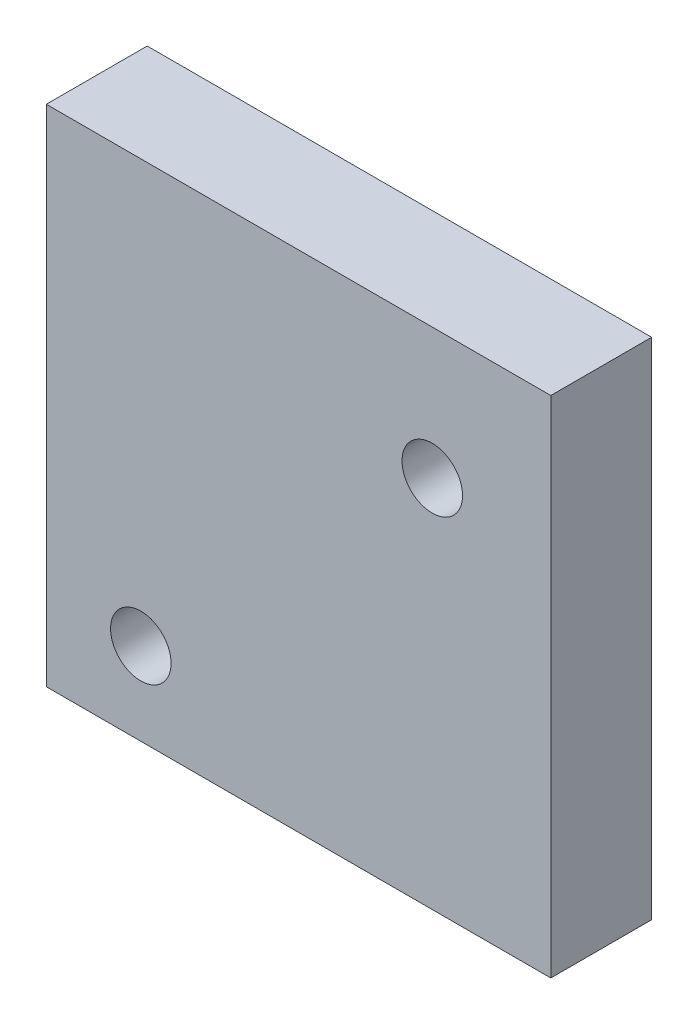
ISO-10303-21;
HEADER;
FILE_DESCRIPTION(('STEP AP214'),'2;1');
FILE_NAME('part.step','',(''),(''),'','','');
FILE_SCHEMA(('AUTOMOTIVE_DESIGN { 1 0 10303 214 1 1 1 1 }'));
ENDSEC;
DATA;
#1=APPLICATION_CONTEXT('core data for automotive mechanical design processes');
#2=APPLICATION_PROTOCOL_DEFINITION('international standard','automotive_design',2000,#1);
#3=PRODUCT_CONTEXT('',#1,'mechanical');
#4=PRODUCT('Part','Part','',(#3));
#5=PRODUCT_RELATED_PRODUCT_CATEGORY('part','',(#4));
#6=PRODUCT_DEFINITION_FORMATION('','',#4);
#7=PRODUCT_DEFINITION_CONTEXT('part definition',#1,'design');
#8=PRODUCT_DEFINITION('design','',#6,#7);
#9=PRODUCT_DEFINITION_SHAPE('','',#8);
#10=(LENGTH_UNIT() NAMED_UNIT(*) SI_UNIT(.MILLI.,.METRE.));
#11=(NAMED_UNIT(*) PLANE_ANGLE_UNIT() SI_UNIT($,.RADIAN.));
#12=(NAMED_UNIT(*) SI_UNIT($,.STERADIAN.) SOLID_ANGLE_UNIT());
#13=UNCERTAINTY_MEASURE_WITH_UNIT(LENGTH_MEASURE(1.E-05),#10,'distance_accuracy_value','');
#14=(GEOMETRIC_REPRESENTATION_CONTEXT(3) GLOBAL_UNCERTAINTY_ASSIGNED_CONTEXT((#13)) GLOBAL_UNIT_ASSIGNED_CONTEXT((#10,
#11,#12)) REPRESENTATION_CONTEXT('',''));
#15=CARTESIAN_POINT('',(0.,0.,0.));
#16=DIRECTION('',(0.,0.,1.));
#17=DIRECTION('',(1.,0.,0.));
#18=AXIS2_PLACEMENT_3D('',#15,#16,#17);
#19=CARTESIAN_POINT('',(0.,0.,-20.));
#20=DIRECTION('',(0.,0.,-1.));
#21=DIRECTION('',(-1.,0.,0.));
#22=AXIS2_PLACEMENT_3D('',#19,#20,#21);
#23=PLANE('',#22);
#24=DIRECTION('',(0.,-1.,0.));
#25=VECTOR('',#24,1.);
#26=CARTESIAN_POINT('',(0.,0.,-20.));
#27=LINE('',#26,#25);
#28=CARTESIAN_POINT('',(0.,100.,-20.));
#29=VERTEX_POINT('',#28);
#30=CARTESIAN_POINT('',(0.,0.,-20.));
#31=VERTEX_POINT('',#30);
#32=EDGE_CURVE('E102',#29,#31,#27,.T.);
#33=ORIENTED_EDGE('',*,*,#32,.F.);
#34=DIRECTION('',(-1.,0.,0.));
#35=VECTOR('',#34,1.);
#36=CARTESIAN_POINT('',(0.,100.,-20.));
#37=LINE('',#36,#35);
#38=CARTESIAN_POINT('',(100.,100.,-20.));
#39=VERTEX_POINT('',#38);
#40=EDGE_CURVE('E97',#39,#29,#37,.T.);
#41=ORIENTED_EDGE('',*,*,#40,.F.);
#42=DIRECTION('',(0.,1.,0.));
#43=VECTOR('',#42,1.);
#44=CARTESIAN_POINT('',(100.,0.,-20.));
#45=LINE('',#44,#43);
#46=CARTESIAN_POINT('',(100.,0.,-20.));
#47=VERTEX_POINT('',#46);
#48=EDGE_CURVE('E89',#47,#39,#45,.T.);
#49=ORIENTED_EDGE('',*,*,#48,.F.);
#50=DIRECTION('',(1.,0.,0.));
#51=VECTOR('',#50,1.);
#52=CARTESIAN_POINT('',(0.,0.,-20.));
#53=LINE('',#52,#51);
#54=EDGE_CURVE('E96',#31,#47,#53,.T.);
#55=ORIENTED_EDGE('',*,*,#54,.F.);
#56=EDGE_LOOP('',(#33,#41,#49,#55));
#57=FACE_BOUND('',#56,.T.);
#58=CARTESIAN_POINT('',(76.5076096586768,74.0582775015923,-20.));
#59=DIRECTION('',(0.,0.,1.));
#60=DIRECTION('',(1.,0.,0.));
#61=AXIS2_PLACEMENT_3D('',#58,#59,#60);
#62=CIRCLE('',#61,5.99999999999999);
#63=CARTESIAN_POINT('',(82.5076096586767,74.0582775015923,-20.));
#64=VERTEX_POINT('',#63);
#65=EDGE_CURVE('E116',#64,#64,#62,.T.);
#66=ORIENTED_EDGE('',*,*,#65,.T.);
#67=EDGE_LOOP('',(#66));
#68=FACE_BOUND('',#67,.T.);
#69=CARTESIAN_POINT('',(18.7309758532592,16.3608224878544,-20.));
#70=DIRECTION('',(0.,0.,1.));
#71=DIRECTION('',(1.,0.,0.));
#72=AXIS2_PLACEMENT_3D('',#69,#70,#71);
#73=CIRCLE('',#72,6.);
#74=CARTESIAN_POINT('',(24.7309758532592,16.3608224878544,-20.));
#75=VERTEX_POINT('',#74);
#76=EDGE_CURVE('E161',#75,#75,#73,.T.);
#77=ORIENTED_EDGE('',*,*,#76,.T.);
#78=EDGE_LOOP('',(#77));
#79=FACE_BOUND('',#78,.T.);
#80=ADVANCED_FACE('F39',(#57,#68,#79),#23,.T.);
#81=CARTESIAN_POINT('',(0.,0.,-20.));
#82=DIRECTION('',(-1.,0.,0.));
#83=DIRECTION('',(0.,0.,1.));
#84=AXIS2_PLACEMENT_3D('',#81,#82,#83);
#85=PLANE('',#84);
#86=DIRECTION('',(0.,-1.,0.));
#87=VECTOR('',#86,1.);
#88=CARTESIAN_POINT('',(0.,0.,0.));
#89=LINE('',#88,#87);
#90=CARTESIAN_POINT('',(0.,100.,0.));
#91=VERTEX_POINT('',#90);
#92=CARTESIAN_POINT('',(0.,0.,0.));
#93=VERTEX_POINT('',#92);
#94=EDGE_CURVE('E111',#91,#93,#89,.T.);
#95=ORIENTED_EDGE('',*,*,#94,.F.);
#96=DIRECTION('',(0.,0.,1.));
#97=VECTOR('',#96,1.);
#98=CARTESIAN_POINT('',(0.,100.,-20.));
#99=LINE('',#98,#97);
#100=EDGE_CURVE('E11',#29,#91,#99,.T.);
#101=ORIENTED_EDGE('',*,*,#100,.F.);
#102=ORIENTED_EDGE('',*,*,#32,.T.);
#103=DIRECTION('',(0.,0.,1.));
#104=VECTOR('',#103,1.);
#105=CARTESIAN_POINT('',(0.,0.,-20.));
#106=LINE('',#105,#104);
#107=EDGE_CURVE('E43',#31,#93,#106,.T.);
#108=ORIENTED_EDGE('',*,*,#107,.T.);
#109=EDGE_LOOP('',(#95,#101,#102,#108));
#110=FACE_BOUND('',#109,.T.);
#111=ADVANCED_FACE('F41',(#110),#85,.T.);
#112=CARTESIAN_POINT('',(0.,100.,-20.));
#113=DIRECTION('',(0.,1.,0.));
#114=DIRECTION('',(0.,0.,1.));
#115=AXIS2_PLACEMENT_3D('',#112,#113,#114);
#116=PLANE('',#115);
#117=DIRECTION('',(-1.,0.,0.));
#118=VECTOR('',#117,1.);
#119=CARTESIAN_POINT('',(0.,100.,0.));
#120=LINE('',#119,#118);
#121=CARTESIAN_POINT('',(100.,100.,0.));
#122=VERTEX_POINT('',#121);
#123=EDGE_CURVE('E105',#122,#91,#120,.T.);
#124=ORIENTED_EDGE('',*,*,#123,.F.);
#125=DIRECTION('',(0.,0.,1.));
#126=VECTOR('',#125,1.);
#127=CARTESIAN_POINT('',(100.,100.,-20.));
#128=LINE('',#127,#126);
#129=EDGE_CURVE('E50',#39,#122,#128,.T.);
#130=ORIENTED_EDGE('',*,*,#129,.F.);
#131=ORIENTED_EDGE('',*,*,#40,.T.);
#132=ORIENTED_EDGE('',*,*,#100,.T.);
#133=EDGE_LOOP('',(#124,#130,#131,#132));
#134=FACE_BOUND('',#133,.T.);
#135=ADVANCED_FACE('F128',(#134),#116,.T.);
#136=CARTESIAN_POINT('',(100.,0.,-20.));
#137=DIRECTION('',(1.,0.,0.));
#138=DIRECTION('',(0.,0.,-1.));
#139=AXIS2_PLACEMENT_3D('',#136,#137,#138);
#140=PLANE('',#139);
#141=DIRECTION('',(0.,1.,0.));
#142=VECTOR('',#141,1.);
#143=CARTESIAN_POINT('',(100.,0.,0.));
#144=LINE('',#143,#142);
#145=CARTESIAN_POINT('',(100.,0.,0.));
#146=VERTEX_POINT('',#145);
#147=EDGE_CURVE('E91',#146,#122,#144,.T.);
#148=ORIENTED_EDGE('',*,*,#147,.F.);
#149=DIRECTION('',(0.,0.,1.));
#150=VECTOR('',#149,1.);
#151=CARTESIAN_POINT('',(100.,0.,-20.));
#152=LINE('',#151,#150);
#153=EDGE_CURVE('E86',#47,#146,#152,.T.);
#154=ORIENTED_EDGE('',*,*,#153,.F.);
#155=ORIENTED_EDGE('',*,*,#48,.T.);
#156=ORIENTED_EDGE('',*,*,#129,.T.);
#157=EDGE_LOOP('',(#148,#154,#155,#156));
#158=FACE_BOUND('',#157,.T.);
#159=ADVANCED_FACE('F88',(#158),#140,.T.);
#160=CARTESIAN_POINT('',(0.,0.,-20.));
#161=DIRECTION('',(0.,-1.,0.));
#162=DIRECTION('',(0.,0.,-1.));
#163=AXIS2_PLACEMENT_3D('',#160,#161,#162);
#164=PLANE('',#163);
#165=DIRECTION('',(1.,0.,0.));
#166=VECTOR('',#165,1.);
#167=CARTESIAN_POINT('',(0.,0.,0.));
#168=LINE('',#167,#166);
#169=EDGE_CURVE('E115',#93,#146,#168,.T.);
#170=ORIENTED_EDGE('',*,*,#169,.F.);
#171=ORIENTED_EDGE('',*,*,#107,.F.);
#172=ORIENTED_EDGE('',*,*,#54,.T.);
#173=ORIENTED_EDGE('',*,*,#153,.T.);
#174=EDGE_LOOP('',(#170,#171,#172,#173));
#175=FACE_BOUND('',#174,.T.);
#176=ADVANCED_FACE('F100',(#175),#164,.T.);
#177=CARTESIAN_POINT('',(0.,0.,0.));
#178=DIRECTION('',(0.,0.,-1.));
#179=DIRECTION('',(-1.,0.,0.));
#180=AXIS2_PLACEMENT_3D('',#177,#178,#179);
#181=PLANE('',#180);
#182=CARTESIAN_POINT('',(18.7309758532592,16.3608224878544,0.));
#183=DIRECTION('',(0.,0.,1.));
#184=DIRECTION('',(1.,0.,0.));
#185=AXIS2_PLACEMENT_3D('',#182,#183,#184);
#186=CIRCLE('',#185,6.);
#187=CARTESIAN_POINT('',(24.7309758532592,16.3608224878544,0.));
#188=VERTEX_POINT('',#187);
#189=EDGE_CURVE('E155',#188,#188,#186,.T.);
#190=ORIENTED_EDGE('',*,*,#189,.F.);
#191=EDGE_LOOP('',(#190));
#192=FACE_BOUND('',#191,.T.);
#193=CARTESIAN_POINT('',(76.5076096586768,74.0582775015923,0.));
#194=DIRECTION('',(0.,0.,1.));
#195=DIRECTION('',(1.,0.,0.));
#196=AXIS2_PLACEMENT_3D('',#193,#194,#195);
#197=CIRCLE('',#196,6.00000000000001);
#198=CARTESIAN_POINT('',(82.5076096586768,74.0582775015923,0.));
#199=VERTEX_POINT('',#198);
#200=EDGE_CURVE('E158',#199,#199,#197,.T.);
#201=ORIENTED_EDGE('',*,*,#200,.F.);
#202=EDGE_LOOP('',(#201));
#203=FACE_BOUND('',#202,.T.);
#204=ORIENTED_EDGE('',*,*,#94,.T.);
#205=ORIENTED_EDGE('',*,*,#169,.T.);
#206=ORIENTED_EDGE('',*,*,#147,.T.);
#207=ORIENTED_EDGE('',*,*,#123,.T.);
#208=EDGE_LOOP('',(#204,#205,#206,#207));
#209=FACE_BOUND('',#208,.T.);
#210=ADVANCED_FACE('F127',(#192,#203,#209),#181,.F.);
#211=CARTESIAN_POINT('',(76.5076096586768,74.0582775015923,0.));
#212=DIRECTION('',(0.,0.,1.));
#213=DIRECTION('',(1.,0.,0.));
#214=AXIS2_PLACEMENT_3D('',#211,#212,#213);
#215=CYLINDRICAL_SURFACE('',#214,6.);
#216=ORIENTED_EDGE('',*,*,#65,.F.);
#217=EDGE_LOOP('',(#216));
#218=FACE_BOUND('',#217,.T.);
#219=ORIENTED_EDGE('',*,*,#200,.T.);
#220=EDGE_LOOP('',(#219));
#221=FACE_BOUND('',#220,.T.);
#222=ADVANCED_FACE('F142',(#218,#221),#215,.F.);
#223=CARTESIAN_POINT('',(18.7309758532592,16.3608224878544,0.));
#224=DIRECTION('',(0.,0.,1.));
#225=DIRECTION('',(1.,0.,0.));
#226=AXIS2_PLACEMENT_3D('',#223,#224,#225);
#227=CYLINDRICAL_SURFACE('',#226,6.);
#228=ORIENTED_EDGE('',*,*,#76,.F.);
#229=EDGE_LOOP('',(#228));
#230=FACE_BOUND('',#229,.T.);
#231=ORIENTED_EDGE('',*,*,#189,.T.);
#232=EDGE_LOOP('',(#231));
#233=FACE_BOUND('',#232,.T.);
#234=ADVANCED_FACE('F150',(#230,#233),#227,.F.);
#235=CLOSED_SHELL('',(#80,#111,#135,#159,#176,#210,#222,#234));
#236=MANIFOLD_SOLID_BREP('B2',#235);
#237=ADVANCED_BREP_SHAPE_REPRESENTATION('',(#18,#236),#14);
#238=SHAPE_DEFINITION_REPRESENTATION(#9,#237);
ENDSEC;
END-ISO-10303-21;
